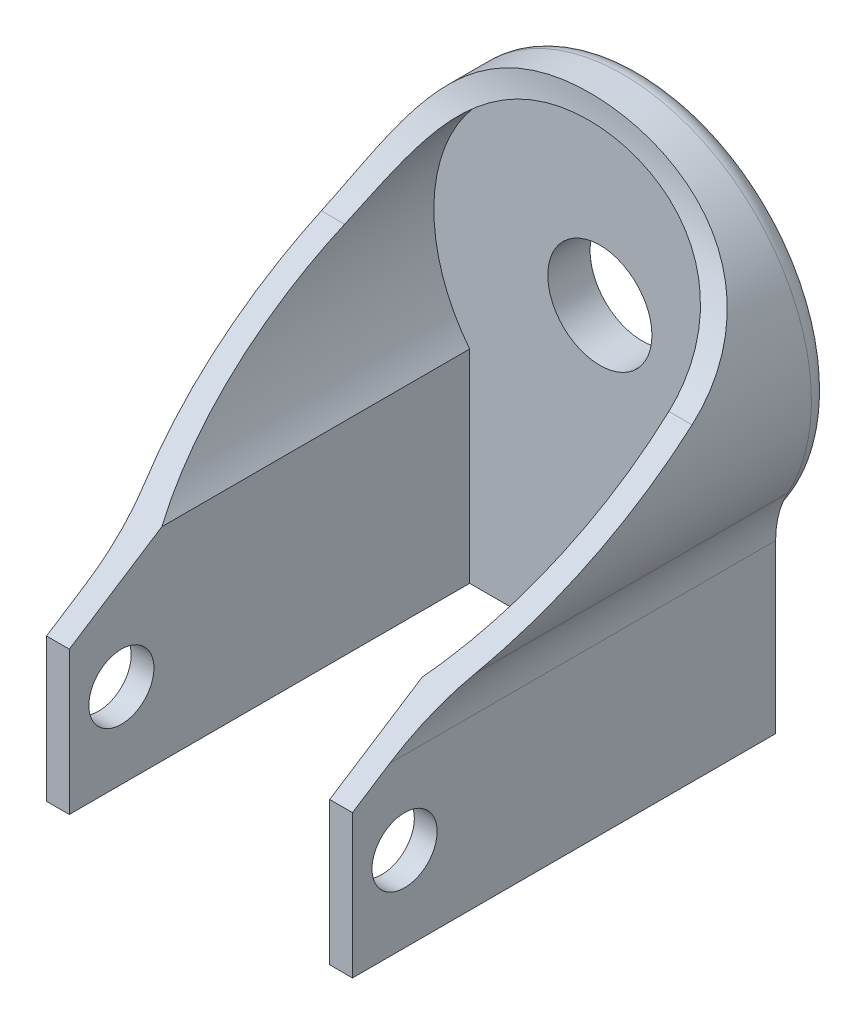
ISO-10303-21;
HEADER;
FILE_DESCRIPTION(('STEP AP214'),'2;1');
FILE_NAME('part.step','',(''),(''),'','','');
FILE_SCHEMA(('AUTOMOTIVE_DESIGN { 1 0 10303 214 1 1 1 1 }'));
ENDSEC;
DATA;
#1=APPLICATION_CONTEXT('core data for automotive mechanical design processes');
#2=APPLICATION_PROTOCOL_DEFINITION('international standard','automotive_design',2000,#1);
#3=PRODUCT_CONTEXT('',#1,'mechanical');
#4=PRODUCT('Part','Part','',(#3));
#5=PRODUCT_RELATED_PRODUCT_CATEGORY('part','',(#4));
#6=PRODUCT_DEFINITION_FORMATION('','',#4);
#7=PRODUCT_DEFINITION_CONTEXT('part definition',#1,'design');
#8=PRODUCT_DEFINITION('design','',#6,#7);
#9=PRODUCT_DEFINITION_SHAPE('','',#8);
#10=(LENGTH_UNIT() NAMED_UNIT(*) SI_UNIT(.MILLI.,.METRE.));
#11=(NAMED_UNIT(*) PLANE_ANGLE_UNIT() SI_UNIT($,.RADIAN.));
#12=(NAMED_UNIT(*) SI_UNIT($,.STERADIAN.) SOLID_ANGLE_UNIT());
#13=UNCERTAINTY_MEASURE_WITH_UNIT(LENGTH_MEASURE(1.E-05),#10,'distance_accuracy_value','');
#14=(GEOMETRIC_REPRESENTATION_CONTEXT(3) GLOBAL_UNCERTAINTY_ASSIGNED_CONTEXT((#13)) GLOBAL_UNIT_ASSIGNED_CONTEXT((#10,
#11,#12)) REPRESENTATION_CONTEXT('',''));
#15=CARTESIAN_POINT('',(0.,0.,0.));
#16=DIRECTION('',(0.,0.,1.));
#17=DIRECTION('',(1.,0.,0.));
#18=AXIS2_PLACEMENT_3D('',#15,#16,#17);
#19=CARTESIAN_POINT('',(0.,0.,0.));
#20=DIRECTION('',(0.,0.,1.));
#21=DIRECTION('',(1.,0.,0.));
#22=AXIS2_PLACEMENT_3D('',#19,#20,#21);
#23=PLANE('',#22);
#24=CARTESIAN_POINT('',(0.,0.,0.));
#25=DIRECTION('',(0.,0.,-1.));
#26=DIRECTION('',(-1.,0.,0.));
#27=AXIS2_PLACEMENT_3D('',#24,#25,#26);
#28=CIRCLE('',#27,29.);
#29=CARTESIAN_POINT('',(25.375,-14.0395646300019,0.));
#30=VERTEX_POINT('',#29);
#31=CARTESIAN_POINT('',(-25.375,-14.0395646300019,0.));
#32=VERTEX_POINT('',#31);
#33=EDGE_CURVE('E136',#30,#32,#28,.T.);
#34=ORIENTED_EDGE('',*,*,#33,.F.);
#35=CARTESIAN_POINT('',(38.5,-21.3014084041408,0.));
#36=DIRECTION('',(0.,0.,1.));
#37=DIRECTION('',(1.,0.,0.));
#38=AXIS2_PLACEMENT_3D('',#35,#36,#37);
#39=CIRCLE('',#38,15.);
#40=CARTESIAN_POINT('',(23.5,-21.3014084041408,0.));
#41=VERTEX_POINT('',#40);
#42=EDGE_CURVE('E50',#30,#41,#39,.T.);
#43=ORIENTED_EDGE('',*,*,#42,.T.);
#44=DIRECTION('',(0.,1.,0.));
#45=VECTOR('',#44,1.);
#46=CARTESIAN_POINT('',(23.5,-47.,0.));
#47=LINE('',#46,#45);
#48=CARTESIAN_POINT('',(23.5,-47.,0.));
#49=VERTEX_POINT('',#48);
#50=EDGE_CURVE('E329',#49,#41,#47,.T.);
#51=ORIENTED_EDGE('',*,*,#50,.F.);
#52=DIRECTION('',(1.,0.,0.));
#53=VECTOR('',#52,1.);
#54=CARTESIAN_POINT('',(-23.5,-47.,0.));
#55=LINE('',#54,#53);
#56=CARTESIAN_POINT('',(-23.5,-47.,0.));
#57=VERTEX_POINT('',#56);
#58=EDGE_CURVE('E326',#57,#49,#55,.T.);
#59=ORIENTED_EDGE('',*,*,#58,.F.);
#60=DIRECTION('',(0.,-1.,0.));
#61=VECTOR('',#60,1.);
#62=CARTESIAN_POINT('',(-23.5,-16.9926454679664,0.));
#63=LINE('',#62,#61);
#64=CARTESIAN_POINT('',(-23.5,-21.3014084041408,0.));
#65=VERTEX_POINT('',#64);
#66=EDGE_CURVE('E340',#65,#57,#63,.T.);
#67=ORIENTED_EDGE('',*,*,#66,.F.);
#68=CARTESIAN_POINT('',(-38.5,-21.3014084041408,0.));
#69=DIRECTION('',(0.,0.,1.));
#70=DIRECTION('',(1.,0.,0.));
#71=AXIS2_PLACEMENT_3D('',#68,#69,#70);
#72=CIRCLE('',#71,15.);
#73=EDGE_CURVE('E141',#65,#32,#72,.T.);
#74=ORIENTED_EDGE('',*,*,#73,.T.);
#75=EDGE_LOOP('',(#34,#43,#51,#59,#67,#74));
#76=FACE_BOUND('',#75,.T.);
#77=ADVANCED_FACE('F35',(#76),#23,.F.);
#78=CARTESIAN_POINT('',(0.,0.,65.));
#79=DIRECTION('',(0.,0.,1.));
#80=DIRECTION('',(1.,0.,0.));
#81=AXIS2_PLACEMENT_3D('',#78,#79,#80);
#82=PLANE('',#81);
#83=DIRECTION('',(1.,0.,0.));
#84=VECTOR('',#83,1.);
#85=CARTESIAN_POINT('',(-23.5,-47.,65.));
#86=LINE('',#85,#84);
#87=CARTESIAN_POINT('',(-23.5,-47.,65.));
#88=VERTEX_POINT('',#87);
#89=CARTESIAN_POINT('',(-20.,-47.,65.));
#90=VERTEX_POINT('',#89);
#91=EDGE_CURVE('E319',#88,#90,#86,.T.);
#92=ORIENTED_EDGE('',*,*,#91,.T.);
#93=DIRECTION('',(0.,-1.,0.));
#94=VECTOR('',#93,1.);
#95=CARTESIAN_POINT('',(-20.,-16.9926454679664,65.));
#96=LINE('',#95,#94);
#97=CARTESIAN_POINT('',(-20.,-25.,65.));
#98=VERTEX_POINT('',#97);
#99=EDGE_CURVE('E274',#98,#90,#96,.T.);
#100=ORIENTED_EDGE('',*,*,#99,.F.);
#101=DIRECTION('',(-1.,0.,0.));
#102=VECTOR('',#101,1.);
#103=CARTESIAN_POINT('',(173.883866509983,-25.,65.));
#104=LINE('',#103,#102);
#105=CARTESIAN_POINT('',(-23.5,-25.,65.));
#106=VERTEX_POINT('',#105);
#107=EDGE_CURVE('E290',#98,#106,#104,.T.);
#108=ORIENTED_EDGE('',*,*,#107,.T.);
#109=DIRECTION('',(0.,-1.,0.));
#110=VECTOR('',#109,1.);
#111=CARTESIAN_POINT('',(-23.5,-16.9926454679664,65.));
#112=LINE('',#111,#110);
#113=EDGE_CURVE('E318',#106,#88,#112,.T.);
#114=ORIENTED_EDGE('',*,*,#113,.T.);
#115=EDGE_LOOP('',(#92,#100,#108,#114));
#116=FACE_BOUND('',#115,.T.);
#117=ADVANCED_FACE('F190',(#116),#82,.T.);
#118=CARTESIAN_POINT('',(-23.5,-47.,65.));
#119=DIRECTION('',(0.,1.,0.));
#120=DIRECTION('',(0.,0.,1.));
#121=AXIS2_PLACEMENT_3D('',#118,#119,#120);
#122=PLANE('',#121);
#123=DIRECTION('',(1.,0.,0.));
#124=VECTOR('',#123,1.);
#125=CARTESIAN_POINT('',(-20.,-47.,3.5));
#126=LINE('',#125,#124);
#127=CARTESIAN_POINT('',(-20.,-47.,3.5));
#128=VERTEX_POINT('',#127);
#129=CARTESIAN_POINT('',(20.,-47.,3.5));
#130=VERTEX_POINT('',#129);
#131=EDGE_CURVE('E264',#128,#130,#126,.T.);
#132=ORIENTED_EDGE('',*,*,#131,.F.);
#133=DIRECTION('',(0.,0.,1.));
#134=VECTOR('',#133,1.);
#135=CARTESIAN_POINT('',(-20.,-47.,3.5));
#136=LINE('',#135,#134);
#137=EDGE_CURVE('E272',#128,#90,#136,.T.);
#138=ORIENTED_EDGE('',*,*,#137,.T.);
#139=ORIENTED_EDGE('',*,*,#91,.F.);
#140=DIRECTION('',(0.,0.,-1.));
#141=VECTOR('',#140,1.);
#142=CARTESIAN_POINT('',(-23.5,-47.,65.));
#143=LINE('',#142,#141);
#144=EDGE_CURVE('E337',#88,#57,#143,.T.);
#145=ORIENTED_EDGE('',*,*,#144,.T.);
#146=ORIENTED_EDGE('',*,*,#58,.T.);
#147=DIRECTION('',(0.,0.,-1.));
#148=VECTOR('',#147,1.);
#149=CARTESIAN_POINT('',(23.5,-47.,65.));
#150=LINE('',#149,#148);
#151=CARTESIAN_POINT('',(23.5,-47.,65.));
#152=VERTEX_POINT('',#151);
#153=EDGE_CURVE('E343',#152,#49,#150,.T.);
#154=ORIENTED_EDGE('',*,*,#153,.F.);
#155=CARTESIAN_POINT('',(20.,-47.,65.));
#156=VERTEX_POINT('',#155);
#157=EDGE_CURVE('E317',#156,#152,#86,.T.);
#158=ORIENTED_EDGE('',*,*,#157,.F.);
#159=DIRECTION('',(0.,0.,1.));
#160=VECTOR('',#159,1.);
#161=CARTESIAN_POINT('',(20.,-47.,3.5));
#162=LINE('',#161,#160);
#163=EDGE_CURVE('E278',#130,#156,#162,.T.);
#164=ORIENTED_EDGE('',*,*,#163,.F.);
#165=EDGE_LOOP('',(#132,#138,#139,#145,#146,#154,#158,#164));
#166=FACE_BOUND('',#165,.T.);
#167=ADVANCED_FACE('F195',(#166),#122,.F.);
#168=CARTESIAN_POINT('',(23.5,-47.,65.));
#169=DIRECTION('',(-1.,0.,0.));
#170=DIRECTION('',(0.,-1.,0.));
#171=AXIS2_PLACEMENT_3D('',#168,#169,#170);
#172=PLANE('',#171);
#173=CARTESIAN_POINT('',(23.5,-34.,57.));
#174=DIRECTION('',(1.,0.,0.));
#175=DIRECTION('',(0.,1.,0.));
#176=AXIS2_PLACEMENT_3D('',#173,#174,#175);
#177=CIRCLE('',#176,5.);
#178=CARTESIAN_POINT('',(23.5,-29.,57.));
#179=VERTEX_POINT('',#178);
#180=EDGE_CURVE('E143',#179,#179,#177,.T.);
#181=ORIENTED_EDGE('',*,*,#180,.F.);
#182=EDGE_LOOP('',(#181));
#183=FACE_BOUND('',#182,.T.);
#184=ORIENTED_EDGE('',*,*,#50,.T.);
#185=DIRECTION('',(0.,0.,1.));
#186=VECTOR('',#185,1.);
#187=CARTESIAN_POINT('',(23.5,-21.3014084041408,52.6021511825292));
#188=LINE('',#187,#186);
#189=CARTESIAN_POINT('',(23.5,-21.3014084041408,59.2734420888212));
#190=VERTEX_POINT('',#189);
#191=EDGE_CURVE('E57',#41,#190,#188,.T.);
#192=ORIENTED_EDGE('',*,*,#191,.T.);
#193=DIRECTION('',(0.,-0.542545058761583,0.840026701488346));
#194=VECTOR('',#193,1.);
#195=CARTESIAN_POINT('',(23.5,-31.4758130973054,75.0265513946465));
#196=LINE('',#195,#194);
#197=CARTESIAN_POINT('',(23.5,-25.,65.));
#198=VERTEX_POINT('',#197);
#199=EDGE_CURVE('E219',#190,#198,#196,.T.);
#200=ORIENTED_EDGE('',*,*,#199,.T.);
#201=DIRECTION('',(0.,1.,0.));
#202=VECTOR('',#201,1.);
#203=CARTESIAN_POINT('',(23.5,-47.,65.));
#204=LINE('',#203,#202);
#205=EDGE_CURVE('E311',#152,#198,#204,.T.);
#206=ORIENTED_EDGE('',*,*,#205,.F.);
#207=ORIENTED_EDGE('',*,*,#153,.T.);
#208=EDGE_LOOP('',(#184,#192,#200,#206,#207));
#209=FACE_BOUND('',#208,.T.);
#210=ADVANCED_FACE('F208',(#183,#209),#172,.F.);
#211=CARTESIAN_POINT('',(0.,0.,65.));
#212=DIRECTION('',(0.,0.,-1.));
#213=DIRECTION('',(-1.,0.,0.));
#214=AXIS2_PLACEMENT_3D('',#211,#212,#213);
#215=CYLINDRICAL_SURFACE('',#214,29.);
#216=DIRECTION('',(0.,0.,-1.));
#217=VECTOR('',#216,1.);
#218=CARTESIAN_POINT('',(25.375,-14.0395646300019,65.));
#219=LINE('',#218,#217);
#220=CARTESIAN_POINT('',(25.375,-14.0395646300019,48.0298733311629));
#221=VERTEX_POINT('',#220);
#222=EDGE_CURVE('E150',#221,#30,#219,.T.);
#223=ORIENTED_EDGE('',*,*,#222,.T.);
#224=CARTESIAN_POINT('',(0.,0.,0.));
#225=DIRECTION('',(0.,0.,-1.));
#226=DIRECTION('',(-1.,0.,0.));
#227=AXIS2_PLACEMENT_3D('',#224,#225,#226);
#228=CIRCLE('',#227,29.);
#229=EDGE_CURVE('E11',#30,#32,#228,.F.);
#230=ORIENTED_EDGE('',*,*,#229,.T.);
#231=DIRECTION('',(0.,0.,-1.));
#232=VECTOR('',#231,1.);
#233=CARTESIAN_POINT('',(-25.375,-14.0395646300019,65.));
#234=LINE('',#233,#232);
#235=CARTESIAN_POINT('',(-25.375,-14.0395646300019,48.029873331163));
#236=VERTEX_POINT('',#235);
#237=EDGE_CURVE('E158',#32,#236,#234,.F.);
#238=ORIENTED_EDGE('',*,*,#237,.T.);
#239=CARTESIAN_POINT('',(0.,0.,26.2923070663571));
#240=DIRECTION('',(0.,-0.840026701488346,-0.542545058761583));
#241=DIRECTION('',(0.,0.542545058761583,-0.840026701488346));
#242=AXIS2_PLACEMENT_3D('',#239,#240,#241);
#243=ELLIPSE('',#242,53.4517816201212,29.);
#244=CARTESIAN_POINT('',(-28.4776718429329,5.47925235832633,17.8087383546757));
#245=VERTEX_POINT('',#244);
#246=EDGE_CURVE('E305',#236,#245,#243,.T.);
#247=ORIENTED_EDGE('',*,*,#246,.T.);
#248=CARTESIAN_POINT('',(-28.4776718429329,5.47925235832634,17.8087383546757));
#249=CARTESIAN_POINT('',(-28.44356778538,5.65648991033113,17.5343086071503));
#250=CARTESIAN_POINT('',(-28.4068547471613,5.83839577934788,17.2632118584632));
#251=CARTESIAN_POINT('',(-28.3276856224153,6.2111655846828,16.7280832450416));
#252=CARTESIAN_POINT('',(-28.2852291590941,6.40203010819088,16.4640518451871));
#253=CARTESIAN_POINT('',(-28.1940288092118,6.79241642588087,15.9433540507129));
#254=CARTESIAN_POINT('',(-28.1452816753913,6.99194265570858,15.6866915441728));
#255=CARTESIAN_POINT('',(-28.0410020940944,7.39907941275824,15.1813138673485));
#256=CARTESIAN_POINT('',(-27.9854697792232,7.60668978193489,14.9325985418694));
#257=CARTESIAN_POINT('',(-27.8077385215757,8.24153674782823,14.198272826896));
#258=CARTESIAN_POINT('',(-27.6745144924004,8.68030822993843,13.7251231965719));
#259=CARTESIAN_POINT('',(-27.374838313063,9.58355652332947,12.8155362664162));
#260=CARTESIAN_POINT('',(-27.208392849796,10.0480281480433,12.3790916036025));
#261=CARTESIAN_POINT('',(-26.837969605278,10.9993163257182,11.5435836670128));
#262=CARTESIAN_POINT('',(-26.6338292335482,11.4862225435544,11.1446940876438));
#263=CARTESIAN_POINT('',(-26.1857657685525,12.4739607575228,10.388566891895));
#264=CARTESIAN_POINT('',(-25.941840387299,12.9747935531807,10.0313316730342));
#265=CARTESIAN_POINT('',(-25.4130225745423,13.9821731127022,9.36040636775042));
#266=CARTESIAN_POINT('',(-25.1282161107759,14.4887058802288,9.04662755262174));
#267=CARTESIAN_POINT('',(-24.5166451935926,15.5010881523199,8.46184368521064));
#268=CARTESIAN_POINT('',(-24.1898831859006,16.0069376949761,8.1908361417032));
#269=CARTESIAN_POINT('',(-23.5154476324199,16.9809798110409,7.70530363406201));
#270=CARTESIAN_POINT('',(-23.1701507363677,17.4496312756417,7.48838734905025));
#271=CARTESIAN_POINT('',(-22.4440659734267,18.3741490100248,7.08967881724001));
#272=CARTESIAN_POINT('',(-22.0632793533889,18.8300157282388,6.90788533717049));
#273=CARTESIAN_POINT('',(-21.2676368845994,19.7242537940354,6.57674961067862));
#274=CARTESIAN_POINT('',(-20.8527475090841,20.1626072797147,6.42743983801033));
#275=CARTESIAN_POINT('',(-19.9914821946206,21.0168645468796,6.15842502914644));
#276=CARTESIAN_POINT('',(-19.5451047707402,21.4327672679836,6.03872139033584));
#277=CARTESIAN_POINT('',(-18.6026938635049,22.2564329355873,5.82070820499327));
#278=CARTESIAN_POINT('',(-18.1053305552984,22.6629911375729,5.72360114543727));
#279=CARTESIAN_POINT('',(-17.0820424595623,23.4439365448943,5.55387304599605));
#280=CARTESIAN_POINT('',(-16.5561171188299,23.8183231267521,5.48125248057325));
#281=CARTESIAN_POINT('',(-15.4786897233347,24.532179979212,5.35637619887749));
#282=CARTESIAN_POINT('',(-14.9271837494574,24.8716448737842,5.3041236147166));
#283=CARTESIAN_POINT('',(-13.8016908945957,25.5133902229425,5.21603942153536));
#284=CARTESIAN_POINT('',(-13.2277026042813,25.8156683414985,5.18020884374143));
#285=CARTESIAN_POINT('',(-11.9781099124518,26.4210553992388,5.11713166909793));
#286=CARTESIAN_POINT('',(-11.2995642974928,26.7183067289214,5.09180004348));
#287=CARTESIAN_POINT('',(-9.92141616597927,27.2601147762316,5.05278923892376));
#288=CARTESIAN_POINT('',(-9.22181203024092,27.5046674300165,5.03911095838965));
#289=CARTESIAN_POINT('',(-7.80558435859299,27.9396088504928,5.0192384018173));
#290=CARTESIAN_POINT('',(-7.08895472157628,28.1299778732735,5.0130468511972));
#291=CARTESIAN_POINT('',(-5.64320174793742,28.4552869192437,5.00482631985486));
#292=CARTESIAN_POINT('',(-4.91407808085984,28.5902254739843,5.00279744940352));
#293=CARTESIAN_POINT('',(-3.3830466400051,28.8132757989496,5.00037850191943));
#294=CARTESIAN_POINT('',(-2.58038086576207,28.8962210002236,5.0001483742541));
#295=CARTESIAN_POINT('',(-0.970898689497761,28.994956337339,4.99995736109074));
#296=CARTESIAN_POINT('',(-0.164082039747753,29.0107424173901,4.99999649185305));
#297=CARTESIAN_POINT('',(1.44819928795306,28.9750406928048,5.00000531276963));
#298=CARTESIAN_POINT('',(2.25366372240361,28.9235418516331,4.99997499153128));
#299=CARTESIAN_POINT('',(3.85749249626186,28.7536093407664,5.00095565319845));
#300=CARTESIAN_POINT('',(4.65585687311171,28.6351760242633,5.00196663060938));
#301=CARTESIAN_POINT('',(6.24879610867915,28.3305033271636,5.0075861181627));
#302=CARTESIAN_POINT('',(7.04322886171763,28.143520830438,5.01223471399488));
#303=CARTESIAN_POINT('',(8.6134680311466,27.7033039889347,5.02917491196232));
#304=CARTESIAN_POINT('',(9.38927400144449,27.4500680591788,5.04146669695498));
#305=CARTESIAN_POINT('',(10.9168548193252,26.8791242074409,5.07897379735108));
#306=CARTESIAN_POINT('',(11.668620131854,26.5613910627232,5.10419417460478));
#307=CARTESIAN_POINT('',(13.141983858478,25.8641173242442,5.17395155548007));
#308=CARTESIAN_POINT('',(13.8635829807853,25.4845781825284,5.21848810533613));
#309=CARTESIAN_POINT('',(15.2605381128452,24.6730306760933,5.33336546672342));
#310=CARTESIAN_POINT('',(15.9364171527933,24.2418735585293,5.40331821180147));
#311=CARTESIAN_POINT('',(16.9194901135261,23.5561210322351,5.53332453042137));
#312=CARTESIAN_POINT('',(17.2421106634304,23.3209894318161,5.58085002854722));
#313=CARTESIAN_POINT('',(17.8764148911081,22.8383992437635,5.68524892773403));
#314=CARTESIAN_POINT('',(18.1880999653791,22.5909422399635,5.7421211298776));
#315=CARTESIAN_POINT('',(18.7994578007281,22.0847846222202,5.86611712751201));
#316=CARTESIAN_POINT('',(19.099144318113,21.826097636835,5.93322873241124));
#317=CARTESIAN_POINT('',(19.6861544111642,21.2981484723361,6.07869900915449));
#318=CARTESIAN_POINT('',(19.9734796529836,21.028887727857,6.15705615902035));
#319=CARTESIAN_POINT('',(20.5351130662154,20.4807968760572,6.32594188700225));
#320=CARTESIAN_POINT('',(20.809422178712,20.201967463084,6.41646958335111));
#321=CARTESIAN_POINT('',(21.3443776544033,19.6359185202576,6.61054093669907));
#322=CARTESIAN_POINT('',(21.6050245153253,19.3486992966465,6.71408411906539));
#323=CARTESIAN_POINT('',(22.3073130758933,18.5431763103281,7.02005340300511));
#324=CARTESIAN_POINT('',(22.7338791323587,18.01713786981,7.23725493758553));
#325=CARTESIAN_POINT('',(23.5398057940092,16.9506484957267,7.71847863473263));
#326=CARTESIAN_POINT('',(23.9191701215113,16.410198702724,7.98249710134015));
#327=CARTESIAN_POINT('',(24.6292401872806,15.3238816626292,8.55942503497026));
#328=CARTESIAN_POINT('',(24.9599708918596,14.7780173498265,8.87230924520433));
#329=CARTESIAN_POINT('',(25.5729827493078,13.6898697581034,9.54771273640907));
#330=CARTESIAN_POINT('',(25.8552686236118,13.1475861351676,9.91022717421812));
#331=CARTESIAN_POINT('',(26.3414871245902,12.1408271944909,10.6369568107317));
#332=CARTESIAN_POINT('',(26.550772465975,11.6749033269191,10.9956141163646));
#333=CARTESIAN_POINT('',(26.9351374446006,10.7584967952852,11.7491321780488));
#334=CARTESIAN_POINT('',(27.1102174770769,10.3080139528548,12.1439925157038));
#335=CARTESIAN_POINT('',(27.4287798362602,9.42768395831853,12.9678284389224));
#336=CARTESIAN_POINT('',(27.5722649880433,8.99783496391403,13.3968009696502));
#337=CARTESIAN_POINT('',(27.8307726578185,8.16326697174595,14.2863045200784));
#338=CARTESIAN_POINT('',(27.9458030783334,7.75854102018693,14.746826732246));
#339=CARTESIAN_POINT('',(28.1371545205322,7.03012979319155,15.6331255514582));
#340=CARTESIAN_POINT('',(28.2165973719933,6.70285322001211,16.0552860441971));
#341=CARTESIAN_POINT('',(28.3233620566367,6.23002248673935,16.7027807824466));
#342=CARTESIAN_POINT('',(28.3568488886958,6.07561148833925,16.9207014153615));
#343=CARTESIAN_POINT('',(28.4200310423148,5.77284433092872,17.3612442664146));
#344=CARTESIAN_POINT('',(28.4497264115452,5.62448809580731,17.5838664253992));
#345=CARTESIAN_POINT('',(28.4776718429329,5.47925235832634,17.8087383546757));
#346=B_SPLINE_CURVE_WITH_KNOTS('',3,(#248,#249,#250,#251,#252,#253,#254,#255,#256,#257,#258,
#259,#260,#261,#262,#263,#264,#265,#266,#267,#268,#269,#270,#271,#272,#273,#274,#275,#276,#277,
#278,#279,#280,#281,#282,#283,#284,#285,#286,#287,#288,#289,#290,#291,#292,#293,#294,#295,#296,
#297,#298,#299,#300,#301,#302,#303,#304,#305,#306,#307,#308,#309,#310,#311,#312,#313,#314,#315,
#316,#317,#318,#319,#320,#321,#322,#323,#324,#325,#326,#327,#328,#329,#330,#331,#332,#333,#334,
#335,#336,#337,#338,#339,#340,#341,#342,#343,#344,#345),.UNSPECIFIED.,.F.,.F.,(4,2,2,2,2,2,2,2,
2,2,2,2,2,2,2,2,2,2,2,2,2,2,2,2,2,2,2,2,2,2,2,2,2,2,2,2,2,2,2,2,2,2,2,2,2,2,2,2,4),(0.,
0.985335015432396,1.97073470451883,2.9566451094061,3.94253624936895,5.91673657125962,
7.89053992106724,9.8730647109133,11.8557035535739,13.8342326308488,15.8126464255643,
17.6741539032206,19.5355960056687,21.3988905151077,23.2622729537275,25.2093542180435,
27.1564732077999,29.1038915002293,31.0514320648151,33.2727709216795,35.4942810151807,
37.7165995688472,39.9389769917693,42.3569503220753,44.775069673555,47.1935857113918,
49.6120889876077,52.0576254736453,54.5032204695041,56.9497737059015,59.3962694722484,
61.8068811672234,63.0126095886617,64.2181834698351,65.4223330880744,66.6263198894695,
67.8302195078846,69.0340752366945,71.1643760376771,73.2945087370346,75.4235440758038,
77.5523718007313,79.4225535513637,81.2927136911371,83.1627065413972,85.0321794677723,
86.6510821345768,87.458479194639,88.2658661022454),.UNSPECIFIED.);
#347=CARTESIAN_POINT('',(28.4776718429329,5.47925235832634,17.8087383546757));
#348=VERTEX_POINT('',#347);
#349=EDGE_CURVE('E211',#245,#348,#346,.T.);
#350=ORIENTED_EDGE('',*,*,#349,.T.);
#351=EDGE_CURVE('E157',#348,#221,#243,.T.);
#352=ORIENTED_EDGE('',*,*,#351,.T.);
#353=EDGE_LOOP('',(#223,#230,#238,#247,#350,#352));
#354=FACE_BOUND('',#353,.T.);
#355=ADVANCED_FACE('F155',(#354),#215,.T.);
#356=CARTESIAN_POINT('',(-23.5,-16.9926454679664,65.));
#357=DIRECTION('',(1.,0.,0.));
#358=DIRECTION('',(0.,1.,0.));
#359=AXIS2_PLACEMENT_3D('',#356,#357,#358);
#360=PLANE('',#359);
#361=CARTESIAN_POINT('',(-23.5,-34.,57.));
#362=DIRECTION('',(1.,0.,0.));
#363=DIRECTION('',(0.,1.,0.));
#364=AXIS2_PLACEMENT_3D('',#361,#362,#363);
#365=CIRCLE('',#364,5.);
#366=CARTESIAN_POINT('',(-23.5,-29.,57.));
#367=VERTEX_POINT('',#366);
#368=EDGE_CURVE('E282',#367,#367,#365,.T.);
#369=ORIENTED_EDGE('',*,*,#368,.T.);
#370=EDGE_LOOP('',(#369));
#371=FACE_BOUND('',#370,.T.);
#372=DIRECTION('',(0.,0.542545058761583,-0.840026701488346));
#373=VECTOR('',#372,1.);
#374=CARTESIAN_POINT('',(-23.5,-22.642994029395,61.3506294658823));
#375=LINE('',#374,#373);
#376=CARTESIAN_POINT('',(-23.5,-21.3014084041408,59.2734420888212));
#377=VERTEX_POINT('',#376);
#378=EDGE_CURVE('E303',#106,#377,#375,.T.);
#379=ORIENTED_EDGE('',*,*,#378,.T.);
#380=DIRECTION('',(0.,0.,1.));
#381=VECTOR('',#380,1.);
#382=CARTESIAN_POINT('',(-23.5,-21.3014084041408,0.));
#383=LINE('',#382,#381);
#384=EDGE_CURVE('E159',#377,#65,#383,.F.);
#385=ORIENTED_EDGE('',*,*,#384,.T.);
#386=ORIENTED_EDGE('',*,*,#66,.T.);
#387=ORIENTED_EDGE('',*,*,#144,.F.);
#388=ORIENTED_EDGE('',*,*,#113,.F.);
#389=EDGE_LOOP('',(#379,#385,#386,#387,#388));
#390=FACE_BOUND('',#389,.T.);
#391=ADVANCED_FACE('F201',(#371,#390),#360,.F.);
#392=DIRECTION('',(0.,1.,0.));
#393=VECTOR('',#392,1.);
#394=CARTESIAN_POINT('',(20.,-47.,65.));
#395=LINE('',#394,#393);
#396=CARTESIAN_POINT('',(20.,-25.,65.));
#397=VERTEX_POINT('',#396);
#398=EDGE_CURVE('E269',#156,#397,#395,.T.);
#399=ORIENTED_EDGE('',*,*,#398,.F.);
#400=ORIENTED_EDGE('',*,*,#157,.T.);
#401=ORIENTED_EDGE('',*,*,#205,.T.);
#402=EDGE_CURVE('E292',#198,#397,#104,.T.);
#403=ORIENTED_EDGE('',*,*,#402,.T.);
#404=EDGE_LOOP('',(#399,#400,#401,#403));
#405=FACE_BOUND('',#404,.T.);
#406=ADVANCED_FACE('F198',(#405),#82,.T.);
#407=CARTESIAN_POINT('',(20.,-47.,65.));
#408=DIRECTION('',(-1.,0.,0.));
#409=DIRECTION('',(0.,-1.,0.));
#410=AXIS2_PLACEMENT_3D('',#407,#408,#409);
#411=PLANE('',#410);
#412=CARTESIAN_POINT('',(20.,-34.,57.));
#413=DIRECTION('',(-1.,0.,0.));
#414=DIRECTION('',(0.,-1.,0.));
#415=AXIS2_PLACEMENT_3D('',#412,#413,#414);
#416=CIRCLE('',#415,5.);
#417=CARTESIAN_POINT('',(20.,-39.,57.));
#418=VERTEX_POINT('',#417);
#419=EDGE_CURVE('E173',#418,#418,#416,.T.);
#420=ORIENTED_EDGE('',*,*,#419,.F.);
#421=EDGE_LOOP('',(#420));
#422=FACE_BOUND('',#421,.T.);
#423=DIRECTION('',(0.,-0.542545058761583,0.840026701488346));
#424=VECTOR('',#423,1.);
#425=CARTESIAN_POINT('',(20.,-31.4758130973054,75.0265513946465));
#426=LINE('',#425,#424);
#427=CARTESIAN_POINT('',(20.,-15.8192920195564,50.7854389831817));
#428=VERTEX_POINT('',#427);
#429=EDGE_CURVE('E300',#428,#397,#426,.T.);
#430=ORIENTED_EDGE('',*,*,#429,.F.);
#431=DIRECTION('',(0.,0.,-1.));
#432=VECTOR('',#431,1.);
#433=CARTESIAN_POINT('',(20.,-15.8192920195564,65.));
#434=LINE('',#433,#432);
#435=CARTESIAN_POINT('',(20.,-15.8192920195564,3.5));
#436=VERTEX_POINT('',#435);
#437=EDGE_CURVE('E325',#428,#436,#434,.T.);
#438=ORIENTED_EDGE('',*,*,#437,.T.);
#439=DIRECTION('',(0.,1.,0.));
#440=VECTOR('',#439,1.);
#441=CARTESIAN_POINT('',(20.,-47.,3.5));
#442=LINE('',#441,#440);
#443=EDGE_CURVE('E218',#130,#436,#442,.T.);
#444=ORIENTED_EDGE('',*,*,#443,.F.);
#445=ORIENTED_EDGE('',*,*,#163,.T.);
#446=ORIENTED_EDGE('',*,*,#398,.T.);
#447=EDGE_LOOP('',(#430,#438,#444,#445,#446));
#448=FACE_BOUND('',#447,.T.);
#449=ADVANCED_FACE('F231',(#422,#448),#411,.T.);
#450=CARTESIAN_POINT('',(0.,0.,65.));
#451=DIRECTION('',(0.,0.,-1.));
#452=DIRECTION('',(-1.,0.,0.));
#453=AXIS2_PLACEMENT_3D('',#450,#451,#452);
#454=CYLINDRICAL_SURFACE('',#453,25.5);
#455=CARTESIAN_POINT('',(0.,0.,26.2923070663571));
#456=DIRECTION('',(0.,-0.840026701488346,-0.542545058761583));
#457=DIRECTION('',(0.,0.542545058761583,-0.840026701488346));
#458=AXIS2_PLACEMENT_3D('',#455,#456,#457);
#459=ELLIPSE('',#458,47.0007045280376,25.5);
#460=CARTESIAN_POINT('',(24.9043729813416,5.47925235832634,17.8087383546757));
#461=VERTEX_POINT('',#460);
#462=EDGE_CURVE('E299',#461,#428,#459,.T.);
#463=ORIENTED_EDGE('',*,*,#462,.F.);
#464=CARTESIAN_POINT('',(-24.9043729813416,5.47925235832634,17.8087383546757));
#465=CARTESIAN_POINT('',(-24.867112729969,5.64859553088864,17.546531544491));
#466=CARTESIAN_POINT('',(-24.827118274419,5.82216000436847,17.2874319973683));
#467=CARTESIAN_POINT('',(-24.7411323679672,6.17736199722468,16.7758176371819));
#468=CARTESIAN_POINT('',(-24.6951404545586,6.3590001385062,16.5233033337573));
#469=CARTESIAN_POINT('',(-24.5966058488431,6.73006958984567,16.0251146083384));
#470=CARTESIAN_POINT('',(-24.5440590799823,6.91950570001097,15.7794445602198));
#471=CARTESIAN_POINT('',(-24.4319212135275,7.30559023253016,15.2955246755504));
#472=CARTESIAN_POINT('',(-24.3723302741719,7.50223849280356,15.0572746724691));
#473=CARTESIAN_POINT('',(-24.1819180511996,8.10318698393791,14.3531721785571));
#474=CARTESIAN_POINT('',(-24.0396535475127,8.51773195913982,13.8989843436563));
#475=CARTESIAN_POINT('',(-23.7208133094791,9.36907339097439,13.0250433083168));
#476=CARTESIAN_POINT('',(-23.5442455512466,9.80586465756379,12.6052821352745));
#477=CARTESIAN_POINT('',(-23.1523480390055,10.6984800570998,11.8005374646537));
#478=CARTESIAN_POINT('',(-22.9368236886463,11.1543904887888,11.4157438402171));
#479=CARTESIAN_POINT('',(-22.4649897448688,12.0765229016983,10.6853881065683));
#480=CARTESIAN_POINT('',(-22.2086774258538,12.5427455702253,10.3398286217665));
#481=CARTESIAN_POINT('',(-21.6543992498675,13.4770643169318,9.68988269029196));
#482=CARTESIAN_POINT('',(-21.3565359164046,13.9451531097952,9.38539842521253));
#483=CARTESIAN_POINT('',(-20.7183520014472,14.8767796281884,8.81668958171539));
#484=CARTESIAN_POINT('',(-20.3780346266653,15.340317694602,8.55246196590705));
#485=CARTESIAN_POINT('',(-19.6824774056282,16.2216405975081,8.08123988039034));
#486=CARTESIAN_POINT('',(-19.3301939764188,16.640276826167,7.87146025108442));
#487=CARTESIAN_POINT('',(-18.5914219448219,17.4617912332125,7.48380804878337));
#488=CARTESIAN_POINT('',(-18.2049348595332,17.8646701093725,7.30593406167577));
#489=CARTESIAN_POINT('',(-17.3994035013264,18.6501363437737,6.9795954429362));
#490=CARTESIAN_POINT('',(-16.9803250370641,19.0327016637145,6.83116229299983));
#491=CARTESIAN_POINT('',(-16.1124806021605,19.7727904080046,6.56113042550151));
#492=CARTESIAN_POINT('',(-15.6637134280997,20.130312816039,6.43953279657361));
#493=CARTESIAN_POINT('',(-14.7280801189613,20.8250174875391,6.21743285315967));
#494=CARTESIAN_POINT('',(-14.2405540619579,21.1614964293475,6.11751348357135));
#495=CARTESIAN_POINT('',(-13.2404461275183,21.8012156427119,5.93918320835773));
#496=CARTESIAN_POINT('',(-12.7278641020631,22.1044557178738,5.86077242981327));
#497=CARTESIAN_POINT('',(-11.6808086970859,22.6751902408183,5.72211409450418));
#498=CARTESIAN_POINT('',(-11.1463344356173,22.9426832466466,5.66186727030839));
#499=CARTESIAN_POINT('',(-10.0586778272779,23.4399369352505,5.55641601540823));
#500=CARTESIAN_POINT('',(-9.50549444479606,23.6696955251668,5.51121241890188));
#501=CARTESIAN_POINT('',(-8.32432175989249,24.1121173246067,5.42891853557118));
#502=CARTESIAN_POINT('',(-7.69459936564828,24.3204167870608,5.39318811457438));
#503=CARTESIAN_POINT('',(-6.42031477967732,24.6874315505246,5.33348008344047));
#504=CARTESIAN_POINT('',(-5.77575169892647,24.8461438726998,5.30950317931993));
#505=CARTESIAN_POINT('',(-4.47573872633998,25.112908801429,5.27079665800957));
#506=CARTESIAN_POINT('',(-3.82028540386018,25.2209451182558,5.25607001378704));
#507=CARTESIAN_POINT('',(-2.50282583858409,25.3855590508465,5.23414508842776));
#508=CARTESIAN_POINT('',(-1.84081946407333,25.4421356301526,5.22694695892345));
#509=CARTESIAN_POINT('',(-0.473705154208921,25.5053336279118,5.2189188685823));
#510=CARTESIAN_POINT('',(0.231558745635572,25.5086823718309,5.21850604774441));
#511=CARTESIAN_POINT('',(1.63993067607597,25.4569680934391,5.22505484183514));
#512=CARTESIAN_POINT('',(2.34303860449492,25.4019023443492,5.23201680101727));
#513=CARTESIAN_POINT('',(3.74231258355273,25.2337422247992,5.25432479777435));
#514=CARTESIAN_POINT('',(4.43847706908187,25.1206350597825,5.26967268397792));
#515=CARTESIAN_POINT('',(5.81875927833313,24.8372382187453,5.31079828698687));
#516=CARTESIAN_POINT('',(6.50287707987542,24.6669489122576,5.33657593639138));
#517=CARTESIAN_POINT('',(7.85872465014043,24.2691769908469,5.40180819893402));
#518=CARTESIAN_POINT('',(8.53033786456436,24.041311611956,5.44135504205207));
#519=CARTESIAN_POINT('',(9.85120695922516,23.5309367045753,5.5380852113047));
#520=CARTESIAN_POINT('',(10.5004623941108,23.2484260883316,5.59526888852696));
#521=CARTESIAN_POINT('',(11.7714009293056,22.6314617086117,5.73204249701103));
#522=CARTESIAN_POINT('',(12.3930837936606,22.2970075007351,5.81163261997462));
#523=CARTESIAN_POINT('',(13.6035743167681,21.5797946515012,5.99855945813748));
#524=CARTESIAN_POINT('',(14.1923840500949,21.1970390633536,6.10589441998896));
#525=CARTESIAN_POINT('',(15.3070225807138,20.4056764386762,6.34852302341312));
#526=CARTESIAN_POINT('',(15.8344785052501,19.9989264860997,6.48239214172431));
#527=CARTESIAN_POINT('',(16.8501454863472,19.1509822562578,6.78551080509564));
#528=CARTESIAN_POINT('',(17.3383577210725,18.7097890138251,6.95475928745547));
#529=CARTESIAN_POINT('',(18.2707153922528,17.8004001592908,7.33268873692751));
#530=CARTESIAN_POINT('',(18.7149401104373,17.3322556248401,7.54129671577043));
#531=CARTESIAN_POINT('',(19.5571357401133,16.3760254072772,8.00166819705804));
#532=CARTESIAN_POINT('',(19.9551123690486,15.8879421991983,8.25342635549542));
#533=CARTESIAN_POINT('',(20.6625155785311,14.9537940967995,8.77278064565148));
#534=CARTESIAN_POINT('',(20.976862927057,14.5088691734201,9.03574645593404));
#535=CARTESIAN_POINT('',(21.5667274547295,13.616616021471,9.59851312776051));
#536=CARTESIAN_POINT('',(21.8422472180247,13.1692879549002,9.89831153544309));
#537=CARTESIAN_POINT('',(22.3555190733697,12.2778623029832,10.5351220499103));
#538=CARTESIAN_POINT('',(22.5931944273216,11.8337729809163,10.8722074781768));
#539=CARTESIAN_POINT('',(23.0316479445285,10.9560001323881,11.5819554923806));
#540=CARTESIAN_POINT('',(23.2324268685519,10.5223163915343,11.9546173445259));
#541=CARTESIAN_POINT('',(23.601515713938,9.66634006446769,12.7379700101802));
#542=CARTESIAN_POINT('',(23.769444749564,9.24422493469461,13.1490335910731));
#543=CARTESIAN_POINT('',(24.0732598695062,8.42143709016105,14.0033000676293));
#544=CARTESIAN_POINT('',(24.2091390109541,8.02076903591906,14.4465098998961));
#545=CARTESIAN_POINT('',(24.452195117274,7.24601063296166,15.361337883589));
#546=CARTESIAN_POINT('',(24.5594325092077,6.87186557297989,15.8328936137113));
#547=CARTESIAN_POINT('',(24.7018662757947,6.3326420096228,16.5597454562019));
#548=CARTESIAN_POINT('',(24.7462670526939,6.15659818658373,16.8052334342155));
#549=CARTESIAN_POINT('',(24.8294270414936,5.81213420622442,17.3024100759276));
#550=CARTESIAN_POINT('',(24.868186652246,5.64371351050069,17.5540982997725));
#551=CARTESIAN_POINT('',(24.9043729813416,5.47925235832634,17.8087383546757));
#552=B_SPLINE_CURVE_WITH_KNOTS('',3,(#464,#465,#466,#467,#468,#469,#470,#471,#472,#473,#474,
#475,#476,#477,#478,#479,#480,#481,#482,#483,#484,#485,#486,#487,#488,#489,#490,#491,#492,#493,
#494,#495,#496,#497,#498,#499,#500,#501,#502,#503,#504,#505,#506,#507,#508,#509,#510,#511,#512,
#513,#514,#515,#516,#517,#518,#519,#520,#521,#522,#523,#524,#525,#526,#527,#528,#529,#530,#531,
#532,#533,#534,#535,#536,#537,#538,#539,#540,#541,#542,#543,#544,#545,#546,#547,#548,#549,#550,
#551),.UNSPECIFIED.,.F.,.F.,(4,2,2,2,2,2,2,2,2,2,2,2,2,2,2,2,2,2,2,2,2,2,2,2,2,2,2,2,2,2,2,2,2,
2,2,2,2,2,2,2,2,2,2,4),(0.,0.943011837865405,1.88609644113478,2.82977051332272,3.77342339105939,
5.66457049508736,7.55527839906407,9.45570579757299,11.356260242749,13.2522055597395,
15.1480077554934,16.9038526030765,18.6596196093816,20.4172540899129,22.1749598591346,
23.9752819521697,25.7756146819549,27.5760200110914,29.3765251621825,31.3670636022367,
33.357721596375,35.3490190468179,37.3403566033733,39.4536870514816,41.567116153853,
43.6810113374021,45.7948928604212,47.9232151793577,50.0515798684835,52.1799627677143,
54.3082111956832,56.3435832925421,58.3788942611163,60.410467397295,62.4417891114104,
64.254211224258,66.0665126553287,67.8824433832086,69.6983366641649,71.534176828942,
73.3704143215417,75.2027466418972,76.1185611630732,77.0343109011779),.UNSPECIFIED.);
#553=CARTESIAN_POINT('',(-24.9043729813415,5.47925235832633,17.8087383546757));
#554=VERTEX_POINT('',#553);
#555=EDGE_CURVE('E163',#554,#461,#552,.T.);
#556=ORIENTED_EDGE('',*,*,#555,.F.);
#557=CARTESIAN_POINT('',(-20.,-15.8192920195564,50.7854389831817));
#558=VERTEX_POINT('',#557);
#559=EDGE_CURVE('E296',#558,#554,#459,.T.);
#560=ORIENTED_EDGE('',*,*,#559,.F.);
#561=DIRECTION('',(0.,0.,-1.));
#562=VECTOR('',#561,1.);
#563=CARTESIAN_POINT('',(-20.,-15.8192920195564,65.));
#564=LINE('',#563,#562);
#565=CARTESIAN_POINT('',(-20.,-15.8192920195564,3.5));
#566=VERTEX_POINT('',#565);
#567=EDGE_CURVE('E327',#558,#566,#564,.T.);
#568=ORIENTED_EDGE('',*,*,#567,.T.);
#569=CARTESIAN_POINT('',(0.,0.,3.5));
#570=DIRECTION('',(0.,0.,1.));
#571=DIRECTION('',(1.,0.,0.));
#572=AXIS2_PLACEMENT_3D('',#569,#570,#571);
#573=CIRCLE('',#572,25.5);
#574=EDGE_CURVE('E267',#436,#566,#573,.T.);
#575=ORIENTED_EDGE('',*,*,#574,.F.);
#576=ORIENTED_EDGE('',*,*,#437,.F.);
#577=EDGE_LOOP('',(#463,#556,#560,#568,#575,#576));
#578=FACE_BOUND('',#577,.T.);
#579=ADVANCED_FACE('F241',(#578),#454,.F.);
#580=CARTESIAN_POINT('',(-20.,-16.9926454679664,65.));
#581=DIRECTION('',(1.,0.,0.));
#582=DIRECTION('',(0.,1.,0.));
#583=AXIS2_PLACEMENT_3D('',#580,#581,#582);
#584=PLANE('',#583);
#585=CARTESIAN_POINT('',(-20.,-34.,57.));
#586=DIRECTION('',(1.,0.,0.));
#587=DIRECTION('',(0.,1.,0.));
#588=AXIS2_PLACEMENT_3D('',#585,#586,#587);
#589=CIRCLE('',#588,5.);
#590=CARTESIAN_POINT('',(-20.,-29.,57.));
#591=VERTEX_POINT('',#590);
#592=EDGE_CURVE('E171',#591,#591,#589,.T.);
#593=ORIENTED_EDGE('',*,*,#592,.F.);
#594=EDGE_LOOP('',(#593));
#595=FACE_BOUND('',#594,.T.);
#596=DIRECTION('',(0.,0.542545058761583,-0.840026701488346));
#597=VECTOR('',#596,1.);
#598=CARTESIAN_POINT('',(-20.,-22.642994029395,61.3506294658823));
#599=LINE('',#598,#597);
#600=EDGE_CURVE('E239',#98,#558,#599,.T.);
#601=ORIENTED_EDGE('',*,*,#600,.F.);
#602=ORIENTED_EDGE('',*,*,#99,.T.);
#603=ORIENTED_EDGE('',*,*,#137,.F.);
#604=DIRECTION('',(0.,-1.,0.));
#605=VECTOR('',#604,1.);
#606=CARTESIAN_POINT('',(-20.,-16.9926454679664,3.5));
#607=LINE('',#606,#605);
#608=EDGE_CURVE('E260',#566,#128,#607,.T.);
#609=ORIENTED_EDGE('',*,*,#608,.F.);
#610=ORIENTED_EDGE('',*,*,#567,.F.);
#611=EDGE_LOOP('',(#601,#602,#603,#609,#610));
#612=FACE_BOUND('',#611,.T.);
#613=ADVANCED_FACE('F245',(#595,#612),#584,.T.);
#614=CARTESIAN_POINT('',(0.,0.,3.5));
#615=DIRECTION('',(0.,0.,1.));
#616=DIRECTION('',(1.,0.,0.));
#617=AXIS2_PLACEMENT_3D('',#614,#615,#616);
#618=PLANE('',#617);
#619=CARTESIAN_POINT('',(0.,0.,3.5));
#620=DIRECTION('',(0.,0.,1.));
#621=DIRECTION('',(1.,0.,0.));
#622=AXIS2_PLACEMENT_3D('',#619,#620,#621);
#623=CIRCLE('',#622,8.);
#624=CARTESIAN_POINT('',(8.,0.,3.5));
#625=VERTEX_POINT('',#624);
#626=EDGE_CURVE('E256',#625,#625,#623,.T.);
#627=ORIENTED_EDGE('',*,*,#626,.F.);
#628=EDGE_LOOP('',(#627));
#629=FACE_BOUND('',#628,.T.);
#630=ORIENTED_EDGE('',*,*,#608,.T.);
#631=ORIENTED_EDGE('',*,*,#131,.T.);
#632=ORIENTED_EDGE('',*,*,#443,.T.);
#633=ORIENTED_EDGE('',*,*,#574,.T.);
#634=EDGE_LOOP('',(#630,#631,#632,#633));
#635=FACE_BOUND('',#634,.T.);
#636=ADVANCED_FACE('F228',(#629,#635),#618,.T.);
#637=CARTESIAN_POINT('',(173.883866509983,29.,33.));
#638=DIRECTION('',(-1.,0.,0.));
#639=DIRECTION('',(0.,0.,1.));
#640=AXIS2_PLACEMENT_3D('',#637,#638,#639);
#641=CYLINDRICAL_SURFACE('',#640,28.);
#642=ORIENTED_EDGE('',*,*,#349,.F.);
#643=DIRECTION('',(-1.,0.,0.));
#644=VECTOR('',#643,1.);
#645=CARTESIAN_POINT('',(173.883866509983,5.47925235832633,17.8087383546757));
#646=LINE('',#645,#644);
#647=EDGE_CURVE('E288',#554,#245,#646,.T.);
#648=ORIENTED_EDGE('',*,*,#647,.F.);
#649=ORIENTED_EDGE('',*,*,#555,.T.);
#650=EDGE_CURVE('E293',#348,#461,#646,.T.);
#651=ORIENTED_EDGE('',*,*,#650,.F.);
#652=EDGE_LOOP('',(#642,#648,#649,#651));
#653=FACE_BOUND('',#652,.T.);
#654=ADVANCED_FACE('F222',(#653),#641,.F.);
#655=CARTESIAN_POINT('',(173.883866509983,5.47925235832633,17.8087383546757));
#656=DIRECTION('',(0.,-0.840026701488346,-0.542545058761583));
#657=DIRECTION('',(0.,0.542545058761583,-0.840026701488346));
#658=AXIS2_PLACEMENT_3D('',#655,#656,#657);
#659=PLANE('',#658);
#660=ORIENTED_EDGE('',*,*,#199,.F.);
#661=CARTESIAN_POINT('',(38.5,-21.3014084041408,59.2734420888212));
#662=DIRECTION('',(0.,-0.840026701488346,-0.542545058761583));
#663=DIRECTION('',(0.,0.542545058761583,-0.840026701488346));
#664=AXIS2_PLACEMENT_3D('',#661,#662,#663);
#665=ELLIPSE('',#664,27.6474732517868,15.);
#666=EDGE_CURVE('E151',#190,#221,#665,.T.);
#667=ORIENTED_EDGE('',*,*,#666,.T.);
#668=ORIENTED_EDGE('',*,*,#351,.F.);
#669=ORIENTED_EDGE('',*,*,#650,.T.);
#670=ORIENTED_EDGE('',*,*,#462,.T.);
#671=ORIENTED_EDGE('',*,*,#429,.T.);
#672=ORIENTED_EDGE('',*,*,#402,.F.);
#673=EDGE_LOOP('',(#660,#667,#668,#669,#670,#671,#672));
#674=FACE_BOUND('',#673,.T.);
#675=ADVANCED_FACE('F227',(#674),#659,.F.);
#676=ORIENTED_EDGE('',*,*,#246,.F.);
#677=CARTESIAN_POINT('',(-38.5,-21.3014084041408,59.2734420888212));
#678=DIRECTION('',(0.,-0.840026701488346,-0.542545058761583));
#679=DIRECTION('',(0.,0.542545058761583,-0.840026701488346));
#680=AXIS2_PLACEMENT_3D('',#677,#678,#679);
#681=ELLIPSE('',#680,27.6474732517868,15.);
#682=EDGE_CURVE('E152',#236,#377,#681,.T.);
#683=ORIENTED_EDGE('',*,*,#682,.T.);
#684=ORIENTED_EDGE('',*,*,#378,.F.);
#685=ORIENTED_EDGE('',*,*,#107,.F.);
#686=ORIENTED_EDGE('',*,*,#600,.T.);
#687=ORIENTED_EDGE('',*,*,#559,.T.);
#688=ORIENTED_EDGE('',*,*,#647,.T.);
#689=EDGE_LOOP('',(#676,#683,#684,#685,#686,#687,#688));
#690=FACE_BOUND('',#689,.T.);
#691=ADVANCED_FACE('F347',(#690),#659,.F.);
#692=CARTESIAN_POINT('',(-38.5,-21.3014084041408,65.));
#693=DIRECTION('',(0.,0.,-1.));
#694=DIRECTION('',(-1.,0.,0.));
#695=AXIS2_PLACEMENT_3D('',#692,#693,#694);
#696=CYLINDRICAL_SURFACE('',#695,15.);
#697=ORIENTED_EDGE('',*,*,#682,.F.);
#698=ORIENTED_EDGE('',*,*,#237,.F.);
#699=ORIENTED_EDGE('',*,*,#73,.F.);
#700=ORIENTED_EDGE('',*,*,#384,.F.);
#701=EDGE_LOOP('',(#697,#698,#699,#700));
#702=FACE_BOUND('',#701,.T.);
#703=ADVANCED_FACE('F358',(#702),#696,.F.);
#704=CARTESIAN_POINT('',(38.5,-21.3014084041408,65.));
#705=DIRECTION('',(0.,0.,-1.));
#706=DIRECTION('',(-1.,0.,0.));
#707=AXIS2_PLACEMENT_3D('',#704,#705,#706);
#708=CYLINDRICAL_SURFACE('',#707,15.);
#709=ORIENTED_EDGE('',*,*,#666,.F.);
#710=ORIENTED_EDGE('',*,*,#191,.F.);
#711=ORIENTED_EDGE('',*,*,#42,.F.);
#712=ORIENTED_EDGE('',*,*,#222,.F.);
#713=EDGE_LOOP('',(#709,#710,#711,#712));
#714=FACE_BOUND('',#713,.T.);
#715=ADVANCED_FACE('F149',(#714),#708,.F.);
#716=CARTESIAN_POINT('',(-29.,-34.,57.));
#717=DIRECTION('',(1.,0.,0.));
#718=DIRECTION('',(0.,1.,0.));
#719=AXIS2_PLACEMENT_3D('',#716,#717,#718);
#720=CYLINDRICAL_SURFACE('',#719,5.);
#721=ORIENTED_EDGE('',*,*,#592,.T.);
#722=EDGE_LOOP('',(#721));
#723=FACE_BOUND('',#722,.T.);
#724=ORIENTED_EDGE('',*,*,#368,.F.);
#725=EDGE_LOOP('',(#724));
#726=FACE_BOUND('',#725,.T.);
#727=ADVANCED_FACE('F366',(#723,#726),#720,.F.);
#728=ORIENTED_EDGE('',*,*,#419,.T.);
#729=EDGE_LOOP('',(#728));
#730=FACE_BOUND('',#729,.T.);
#731=ORIENTED_EDGE('',*,*,#180,.T.);
#732=EDGE_LOOP('',(#731));
#733=FACE_BOUND('',#732,.T.);
#734=ADVANCED_FACE('F186',(#730,#733),#720,.F.);
#735=CARTESIAN_POINT('',(0.,0.,-3.));
#736=DIRECTION('',(0.,0.,-1.));
#737=DIRECTION('',(-1.,0.,0.));
#738=AXIS2_PLACEMENT_3D('',#735,#736,#737);
#739=PLANE('',#738);
#740=CARTESIAN_POINT('',(0.,0.,-3.));
#741=DIRECTION('',(0.,0.,1.));
#742=DIRECTION('',(1.,0.,0.));
#743=AXIS2_PLACEMENT_3D('',#740,#741,#742);
#744=CIRCLE('',#743,8.);
#745=CARTESIAN_POINT('',(8.,0.,-3.));
#746=VERTEX_POINT('',#745);
#747=EDGE_CURVE('E144',#746,#746,#744,.T.);
#748=ORIENTED_EDGE('',*,*,#747,.T.);
#749=EDGE_LOOP('',(#748));
#750=FACE_BOUND('',#749,.T.);
#751=CARTESIAN_POINT('',(0.,0.,-3.));
#752=DIRECTION('',(0.,0.,-1.));
#753=DIRECTION('',(-1.,0.,0.));
#754=AXIS2_PLACEMENT_3D('',#751,#752,#753);
#755=CIRCLE('',#754,26.);
#756=CARTESIAN_POINT('',(-26.,0.,-3.));
#757=VERTEX_POINT('',#756);
#758=EDGE_CURVE('E43',#757,#757,#755,.T.);
#759=ORIENTED_EDGE('',*,*,#758,.T.);
#760=EDGE_LOOP('',(#759));
#761=FACE_BOUND('',#760,.T.);
#762=ADVANCED_FACE('F177',(#750,#761),#739,.T.);
#763=CARTESIAN_POINT('',(0.,0.,0.));
#764=DIRECTION('',(0.,0.,-1.));
#765=DIRECTION('',(-1.,0.,0.));
#766=AXIS2_PLACEMENT_3D('',#763,#764,#765);
#767=TOROIDAL_SURFACE('',#766,26.,3.);
#768=ORIENTED_EDGE('',*,*,#229,.F.);
#769=ORIENTED_EDGE('',*,*,#33,.T.);
#770=EDGE_LOOP('',(#768,#769));
#771=FACE_BOUND('',#770,.T.);
#772=ORIENTED_EDGE('',*,*,#758,.F.);
#773=EDGE_LOOP('',(#772));
#774=FACE_BOUND('',#773,.T.);
#775=ADVANCED_FACE('F37',(#771,#774),#767,.T.);
#776=CARTESIAN_POINT('',(0.,0.,-3.));
#777=DIRECTION('',(0.,0.,1.));
#778=DIRECTION('',(1.,0.,0.));
#779=AXIS2_PLACEMENT_3D('',#776,#777,#778);
#780=CYLINDRICAL_SURFACE('',#779,8.);
#781=ORIENTED_EDGE('',*,*,#747,.F.);
#782=EDGE_LOOP('',(#781));
#783=FACE_BOUND('',#782,.T.);
#784=ORIENTED_EDGE('',*,*,#626,.T.);
#785=EDGE_LOOP('',(#784));
#786=FACE_BOUND('',#785,.T.);
#787=ADVANCED_FACE('F179',(#783,#786),#780,.F.);
#788=CLOSED_SHELL('',(#77,#117,#167,#210,#355,#391,#406,#449,#579,#613,#636,#654,#675,#691,#703,
#715,#727,#734,#762,#775,#787));
#789=MANIFOLD_SOLID_BREP('B2',#788);
#790=ADVANCED_BREP_SHAPE_REPRESENTATION('',(#18,#789),#14);
#791=SHAPE_DEFINITION_REPRESENTATION(#9,#790);
ENDSEC;
END-ISO-10303-21;
